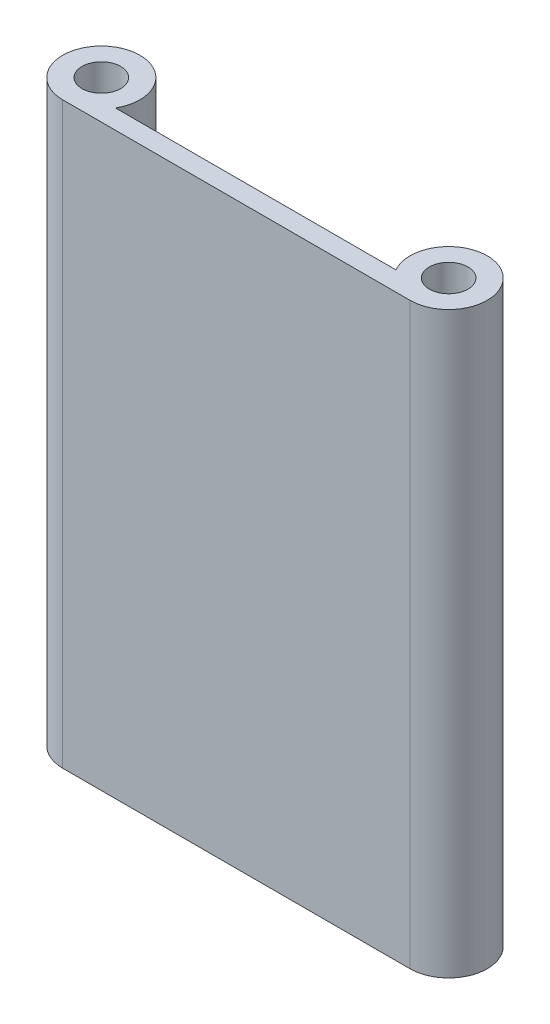
ISO-10303-21;
HEADER;
FILE_DESCRIPTION(('STEP AP214'),'2;1');
FILE_NAME('part.step','',(''),(''),'','','');
FILE_SCHEMA(('AUTOMOTIVE_DESIGN { 1 0 10303 214 1 1 1 1 }'));
ENDSEC;
DATA;
#1=APPLICATION_CONTEXT('core data for automotive mechanical design processes');
#2=APPLICATION_PROTOCOL_DEFINITION('international standard','automotive_design',2000,#1);
#3=PRODUCT_CONTEXT('',#1,'mechanical');
#4=PRODUCT('Part','Part','',(#3));
#5=PRODUCT_RELATED_PRODUCT_CATEGORY('part','',(#4));
#6=PRODUCT_DEFINITION_FORMATION('','',#4);
#7=PRODUCT_DEFINITION_CONTEXT('part definition',#1,'design');
#8=PRODUCT_DEFINITION('design','',#6,#7);
#9=PRODUCT_DEFINITION_SHAPE('','',#8);
#10=(LENGTH_UNIT() NAMED_UNIT(*) SI_UNIT(.MILLI.,.METRE.));
#11=(NAMED_UNIT(*) PLANE_ANGLE_UNIT() SI_UNIT($,.RADIAN.));
#12=(NAMED_UNIT(*) SI_UNIT($,.STERADIAN.) SOLID_ANGLE_UNIT());
#13=UNCERTAINTY_MEASURE_WITH_UNIT(LENGTH_MEASURE(1.E-05),#10,'distance_accuracy_value','');
#14=(GEOMETRIC_REPRESENTATION_CONTEXT(3) GLOBAL_UNCERTAINTY_ASSIGNED_CONTEXT((#13)) GLOBAL_UNIT_ASSIGNED_CONTEXT((#10,
#11,#12)) REPRESENTATION_CONTEXT('',''));
#15=CARTESIAN_POINT('',(0.,0.,0.));
#16=DIRECTION('',(0.,0.,1.));
#17=DIRECTION('',(1.,0.,0.));
#18=AXIS2_PLACEMENT_3D('',#15,#16,#17);
#19=CARTESIAN_POINT('',(28.575,95.25,-4.59347865474679));
#20=DIRECTION('',(0.,1.,0.));
#21=DIRECTION('',(0.,0.,1.));
#22=AXIS2_PLACEMENT_3D('',#19,#20,#21);
#23=PLANE('',#22);
#24=CARTESIAN_POINT('',(-28.575,95.25,-4.59347865474679));
#25=DIRECTION('',(0.,1.,0.));
#26=DIRECTION('',(0.,0.,1.));
#27=AXIS2_PLACEMENT_3D('',#24,#25,#26);
#28=CIRCLE('',#27,3.175);
#29=CARTESIAN_POINT('',(-28.575,95.25,-1.41847865474679));
#30=VERTEX_POINT('',#29);
#31=EDGE_CURVE('E100',#30,#30,#28,.T.);
#32=ORIENTED_EDGE('',*,*,#31,.F.);
#33=EDGE_LOOP('',(#32));
#34=FACE_BOUND('',#33,.T.);
#35=CARTESIAN_POINT('',(28.575,95.25,-4.59347865474679));
#36=DIRECTION('',(0.,1.,0.));
#37=DIRECTION('',(0.,0.,1.));
#38=AXIS2_PLACEMENT_3D('',#35,#36,#37);
#39=CIRCLE('',#38,6.35);
#40=CARTESIAN_POINT('',(28.575,95.25,1.75652134525321));
#41=VERTEX_POINT('',#40);
#42=CARTESIAN_POINT('',(23.0757386859688,95.25,-1.41847865474679));
#43=VERTEX_POINT('',#42);
#44=EDGE_CURVE('E85',#41,#43,#39,.T.);
#45=ORIENTED_EDGE('',*,*,#44,.T.);
#46=DIRECTION('',(-1.,0.,0.));
#47=VECTOR('',#46,1.);
#48=CARTESIAN_POINT('',(-23.0757386859688,95.25,-1.41847865474679));
#49=LINE('',#48,#47);
#50=CARTESIAN_POINT('',(-23.0757386859688,95.25,-1.41847865474679));
#51=VERTEX_POINT('',#50);
#52=EDGE_CURVE('E80',#43,#51,#49,.T.);
#53=ORIENTED_EDGE('',*,*,#52,.T.);
#54=CARTESIAN_POINT('',(-28.575,95.25,-4.59347865474679));
#55=DIRECTION('',(0.,1.,0.));
#56=DIRECTION('',(0.,0.,1.));
#57=AXIS2_PLACEMENT_3D('',#54,#55,#56);
#58=CIRCLE('',#57,6.35);
#59=CARTESIAN_POINT('',(-28.575,95.25,1.75652134525321));
#60=VERTEX_POINT('',#59);
#61=EDGE_CURVE('E83',#51,#60,#58,.T.);
#62=ORIENTED_EDGE('',*,*,#61,.T.);
#63=DIRECTION('',(1.,0.,0.));
#64=VECTOR('',#63,1.);
#65=CARTESIAN_POINT('',(-28.575,95.25,1.75652134525321));
#66=LINE('',#65,#64);
#67=EDGE_CURVE('E50',#60,#41,#66,.T.);
#68=ORIENTED_EDGE('',*,*,#67,.T.);
#69=EDGE_LOOP('',(#45,#53,#62,#68));
#70=FACE_BOUND('',#69,.T.);
#71=CARTESIAN_POINT('',(28.575,95.25,-4.59347865474679));
#72=DIRECTION('',(0.,1.,0.));
#73=DIRECTION('',(0.,0.,1.));
#74=AXIS2_PLACEMENT_3D('',#71,#72,#73);
#75=CIRCLE('',#74,3.17500000000001);
#76=CARTESIAN_POINT('',(28.575,95.25,-1.41847865474678));
#77=VERTEX_POINT('',#76);
#78=EDGE_CURVE('E115',#77,#77,#75,.T.);
#79=ORIENTED_EDGE('',*,*,#78,.F.);
#80=EDGE_LOOP('',(#79));
#81=FACE_BOUND('',#80,.T.);
#82=ADVANCED_FACE('F33',(#34,#70,#81),#23,.T.);
#83=CARTESIAN_POINT('',(28.575,0.,-4.59347865474679));
#84=DIRECTION('',(0.,1.,0.));
#85=DIRECTION('',(0.,0.,1.));
#86=AXIS2_PLACEMENT_3D('',#83,#84,#85);
#87=PLANE('',#86);
#88=CARTESIAN_POINT('',(28.575,0.,-4.59347865474679));
#89=DIRECTION('',(0.,1.,0.));
#90=DIRECTION('',(0.,0.,1.));
#91=AXIS2_PLACEMENT_3D('',#88,#89,#90);
#92=CIRCLE('',#91,6.35);
#93=CARTESIAN_POINT('',(28.575,0.,1.75652134525321));
#94=VERTEX_POINT('',#93);
#95=CARTESIAN_POINT('',(23.0757386859688,0.,-1.41847865474679));
#96=VERTEX_POINT('',#95);
#97=EDGE_CURVE('E97',#94,#96,#92,.T.);
#98=ORIENTED_EDGE('',*,*,#97,.F.);
#99=DIRECTION('',(1.,0.,0.));
#100=VECTOR('',#99,1.);
#101=CARTESIAN_POINT('',(-28.575,0.,1.75652134525321));
#102=LINE('',#101,#100);
#103=CARTESIAN_POINT('',(-28.575,0.,1.75652134525321));
#104=VERTEX_POINT('',#103);
#105=EDGE_CURVE('E73',#104,#94,#102,.T.);
#106=ORIENTED_EDGE('',*,*,#105,.F.);
#107=CARTESIAN_POINT('',(-28.575,0.,-4.59347865474679));
#108=DIRECTION('',(0.,1.,0.));
#109=DIRECTION('',(0.,0.,1.));
#110=AXIS2_PLACEMENT_3D('',#107,#108,#109);
#111=CIRCLE('',#110,6.35);
#112=CARTESIAN_POINT('',(-23.0757386859688,0.,-1.41847865474679));
#113=VERTEX_POINT('',#112);
#114=EDGE_CURVE('E67',#113,#104,#111,.T.);
#115=ORIENTED_EDGE('',*,*,#114,.F.);
#116=DIRECTION('',(-1.,0.,0.));
#117=VECTOR('',#116,1.);
#118=CARTESIAN_POINT('',(-23.0757386859688,0.,-1.41847865474679));
#119=LINE('',#118,#117);
#120=EDGE_CURVE('E89',#96,#113,#119,.T.);
#121=ORIENTED_EDGE('',*,*,#120,.F.);
#122=EDGE_LOOP('',(#98,#106,#115,#121));
#123=FACE_BOUND('',#122,.T.);
#124=CARTESIAN_POINT('',(-28.575,0.,-4.59347865474679));
#125=DIRECTION('',(0.,1.,0.));
#126=DIRECTION('',(0.,0.,1.));
#127=AXIS2_PLACEMENT_3D('',#124,#125,#126);
#128=CIRCLE('',#127,3.175);
#129=CARTESIAN_POINT('',(-28.575,0.,-1.41847865474679));
#130=VERTEX_POINT('',#129);
#131=EDGE_CURVE('E112',#130,#130,#128,.T.);
#132=ORIENTED_EDGE('',*,*,#131,.T.);
#133=EDGE_LOOP('',(#132));
#134=FACE_BOUND('',#133,.T.);
#135=CARTESIAN_POINT('',(28.575,0.,-4.59347865474679));
#136=DIRECTION('',(0.,1.,0.));
#137=DIRECTION('',(0.,0.,1.));
#138=AXIS2_PLACEMENT_3D('',#135,#136,#137);
#139=CIRCLE('',#138,3.17500000000001);
#140=CARTESIAN_POINT('',(28.575,0.,-1.41847865474678));
#141=VERTEX_POINT('',#140);
#142=EDGE_CURVE('E118',#141,#141,#139,.T.);
#143=ORIENTED_EDGE('',*,*,#142,.T.);
#144=EDGE_LOOP('',(#143));
#145=FACE_BOUND('',#144,.T.);
#146=ADVANCED_FACE('F108',(#123,#134,#145),#87,.F.);
#147=CARTESIAN_POINT('',(28.575,95.25,-4.59347865474679));
#148=DIRECTION('',(0.,-1.,0.));
#149=DIRECTION('',(0.,0.,-1.));
#150=AXIS2_PLACEMENT_3D('',#147,#148,#149);
#151=CYLINDRICAL_SURFACE('',#150,6.35);
#152=ORIENTED_EDGE('',*,*,#97,.T.);
#153=DIRECTION('',(0.,-1.,0.));
#154=VECTOR('',#153,1.);
#155=CARTESIAN_POINT('',(23.0757386859688,95.25,-1.41847865474679));
#156=LINE('',#155,#154);
#157=EDGE_CURVE('E11',#43,#96,#156,.T.);
#158=ORIENTED_EDGE('',*,*,#157,.F.);
#159=ORIENTED_EDGE('',*,*,#44,.F.);
#160=DIRECTION('',(0.,-1.,0.));
#161=VECTOR('',#160,1.);
#162=CARTESIAN_POINT('',(28.575,95.25,1.75652134525321));
#163=LINE('',#162,#161);
#164=EDGE_CURVE('E93',#41,#94,#163,.T.);
#165=ORIENTED_EDGE('',*,*,#164,.T.);
#166=EDGE_LOOP('',(#152,#158,#159,#165));
#167=FACE_BOUND('',#166,.T.);
#168=ADVANCED_FACE('F35',(#167),#151,.T.);
#169=CARTESIAN_POINT('',(-23.0757386859688,95.25,-1.41847865474679));
#170=DIRECTION('',(0.,0.,1.));
#171=DIRECTION('',(1.,0.,0.));
#172=AXIS2_PLACEMENT_3D('',#169,#170,#171);
#173=PLANE('',#172);
#174=ORIENTED_EDGE('',*,*,#120,.T.);
#175=DIRECTION('',(0.,-1.,0.));
#176=VECTOR('',#175,1.);
#177=CARTESIAN_POINT('',(-23.0757386859688,95.25,-1.41847865474679));
#178=LINE('',#177,#176);
#179=EDGE_CURVE('E42',#51,#113,#178,.T.);
#180=ORIENTED_EDGE('',*,*,#179,.F.);
#181=ORIENTED_EDGE('',*,*,#52,.F.);
#182=ORIENTED_EDGE('',*,*,#157,.T.);
#183=EDGE_LOOP('',(#174,#180,#181,#182));
#184=FACE_BOUND('',#183,.T.);
#185=ADVANCED_FACE('F88',(#184),#173,.F.);
#186=CARTESIAN_POINT('',(-28.575,95.25,-4.59347865474679));
#187=DIRECTION('',(0.,-1.,0.));
#188=DIRECTION('',(0.,0.,-1.));
#189=AXIS2_PLACEMENT_3D('',#186,#187,#188);
#190=CYLINDRICAL_SURFACE('',#189,6.35);
#191=ORIENTED_EDGE('',*,*,#114,.T.);
#192=DIRECTION('',(0.,-1.,0.));
#193=VECTOR('',#192,1.);
#194=CARTESIAN_POINT('',(-28.575,95.25,1.75652134525321));
#195=LINE('',#194,#193);
#196=EDGE_CURVE('E90',#60,#104,#195,.T.);
#197=ORIENTED_EDGE('',*,*,#196,.F.);
#198=ORIENTED_EDGE('',*,*,#61,.F.);
#199=ORIENTED_EDGE('',*,*,#179,.T.);
#200=EDGE_LOOP('',(#191,#197,#198,#199));
#201=FACE_BOUND('',#200,.T.);
#202=ADVANCED_FACE('F91',(#201),#190,.T.);
#203=CARTESIAN_POINT('',(-28.575,95.25,1.75652134525321));
#204=DIRECTION('',(0.,0.,-1.));
#205=DIRECTION('',(-1.,0.,0.));
#206=AXIS2_PLACEMENT_3D('',#203,#204,#205);
#207=PLANE('',#206);
#208=ORIENTED_EDGE('',*,*,#105,.T.);
#209=ORIENTED_EDGE('',*,*,#164,.F.);
#210=ORIENTED_EDGE('',*,*,#67,.F.);
#211=ORIENTED_EDGE('',*,*,#196,.T.);
#212=EDGE_LOOP('',(#208,#209,#210,#211));
#213=FACE_BOUND('',#212,.T.);
#214=ADVANCED_FACE('F105',(#213),#207,.F.);
#215=CARTESIAN_POINT('',(-28.575,95.25,-4.59347865474679));
#216=DIRECTION('',(0.,-1.,0.));
#217=DIRECTION('',(0.,0.,-1.));
#218=AXIS2_PLACEMENT_3D('',#215,#216,#217);
#219=CYLINDRICAL_SURFACE('',#218,3.175);
#220=ORIENTED_EDGE('',*,*,#31,.T.);
#221=EDGE_LOOP('',(#220));
#222=FACE_BOUND('',#221,.T.);
#223=ORIENTED_EDGE('',*,*,#131,.F.);
#224=EDGE_LOOP('',(#223));
#225=FACE_BOUND('',#224,.T.);
#226=ADVANCED_FACE('F135',(#222,#225),#219,.F.);
#227=CARTESIAN_POINT('',(28.575,95.25,-4.59347865474679));
#228=DIRECTION('',(0.,-1.,0.));
#229=DIRECTION('',(0.,0.,-1.));
#230=AXIS2_PLACEMENT_3D('',#227,#228,#229);
#231=CYLINDRICAL_SURFACE('',#230,3.17500000000001);
#232=ORIENTED_EDGE('',*,*,#78,.T.);
#233=EDGE_LOOP('',(#232));
#234=FACE_BOUND('',#233,.T.);
#235=ORIENTED_EDGE('',*,*,#142,.F.);
#236=EDGE_LOOP('',(#235));
#237=FACE_BOUND('',#236,.T.);
#238=ADVANCED_FACE('F124',(#234,#237),#231,.F.);
#239=CLOSED_SHELL('',(#82,#146,#168,#185,#202,#214,#226,#238));
#240=MANIFOLD_SOLID_BREP('B2',#239);
#241=ADVANCED_BREP_SHAPE_REPRESENTATION('',(#18,#240),#14);
#242=SHAPE_DEFINITION_REPRESENTATION(#9,#241);
ENDSEC;
END-ISO-10303-21;
